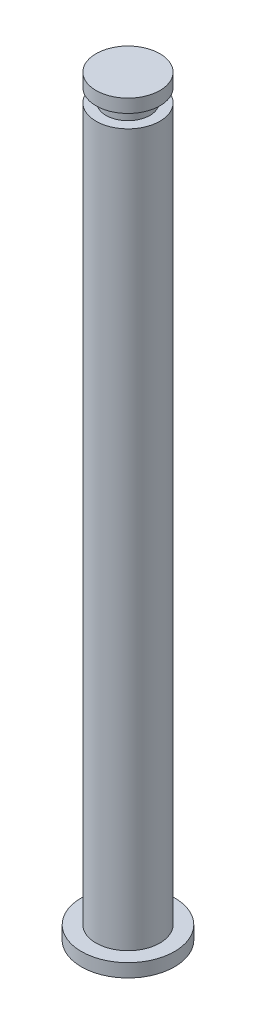
ISO-10303-21;
HEADER;
FILE_DESCRIPTION(('STEP AP214'),'2;1');
FILE_NAME('part.step','',(''),(''),'','','');
FILE_SCHEMA(('AUTOMOTIVE_DESIGN { 1 0 10303 214 1 1 1 1 }'));
ENDSEC;
DATA;
#1=APPLICATION_CONTEXT('core data for automotive mechanical design processes');
#2=APPLICATION_PROTOCOL_DEFINITION('international standard','automotive_design',2000,#1);
#3=PRODUCT_CONTEXT('',#1,'mechanical');
#4=PRODUCT('Part','Part','',(#3));
#5=PRODUCT_RELATED_PRODUCT_CATEGORY('part','',(#4));
#6=PRODUCT_DEFINITION_FORMATION('','',#4);
#7=PRODUCT_DEFINITION_CONTEXT('part definition',#1,'design');
#8=PRODUCT_DEFINITION('design','',#6,#7);
#9=PRODUCT_DEFINITION_SHAPE('','',#8);
#10=(LENGTH_UNIT() NAMED_UNIT(*) SI_UNIT(.MILLI.,.METRE.));
#11=(NAMED_UNIT(*) PLANE_ANGLE_UNIT() SI_UNIT($,.RADIAN.));
#12=(NAMED_UNIT(*) SI_UNIT($,.STERADIAN.) SOLID_ANGLE_UNIT());
#13=UNCERTAINTY_MEASURE_WITH_UNIT(LENGTH_MEASURE(1.E-05),#10,'distance_accuracy_value','');
#14=(GEOMETRIC_REPRESENTATION_CONTEXT(3) GLOBAL_UNCERTAINTY_ASSIGNED_CONTEXT((#13)) GLOBAL_UNIT_ASSIGNED_CONTEXT((#10,
#11,#12)) REPRESENTATION_CONTEXT('',''));
#15=CARTESIAN_POINT('',(0.,0.,0.));
#16=DIRECTION('',(0.,0.,1.));
#17=DIRECTION('',(1.,0.,0.));
#18=AXIS2_PLACEMENT_3D('',#15,#16,#17);
#19=CARTESIAN_POINT('',(0.,56.5,0.));
#20=DIRECTION('',(0.,-1.,0.));
#21=DIRECTION('',(0.,0.,-1.));
#22=AXIS2_PLACEMENT_3D('',#19,#20,#21);
#23=CYLINDRICAL_SURFACE('',#22,2.4);
#24=CARTESIAN_POINT('',(0.,1.,0.));
#25=DIRECTION('',(0.,1.,0.));
#26=DIRECTION('',(0.,0.,1.));
#27=AXIS2_PLACEMENT_3D('',#24,#25,#26);
#28=CIRCLE('',#27,2.4);
#29=CARTESIAN_POINT('',(0.,1.,2.4));
#30=VERTEX_POINT('',#29);
#31=EDGE_CURVE('E50',#30,#30,#28,.T.);
#32=ORIENTED_EDGE('',*,*,#31,.T.);
#33=EDGE_LOOP('',(#32));
#34=FACE_BOUND('',#33,.T.);
#35=CARTESIAN_POINT('',(0.,54.5,0.));
#36=DIRECTION('',(0.,1.,0.));
#37=DIRECTION('',(0.,0.,1.));
#38=AXIS2_PLACEMENT_3D('',#35,#36,#37);
#39=CIRCLE('',#38,2.4);
#40=CARTESIAN_POINT('',(0.,54.5,2.4));
#41=VERTEX_POINT('',#40);
#42=EDGE_CURVE('E57',#41,#41,#39,.T.);
#43=ORIENTED_EDGE('',*,*,#42,.F.);
#44=EDGE_LOOP('',(#43));
#45=FACE_BOUND('',#44,.T.);
#46=ADVANCED_FACE('F39',(#34,#45),#23,.T.);
#47=CARTESIAN_POINT('',(0.,1.,0.));
#48=DIRECTION('',(0.,1.,0.));
#49=DIRECTION('',(0.,0.,1.));
#50=AXIS2_PLACEMENT_3D('',#47,#48,#49);
#51=PLANE('',#50);
#52=CARTESIAN_POINT('',(0.,1.,0.));
#53=DIRECTION('',(0.,1.,0.));
#54=DIRECTION('',(0.,0.,1.));
#55=AXIS2_PLACEMENT_3D('',#52,#53,#54);
#56=CIRCLE('',#55,3.5);
#57=CARTESIAN_POINT('',(0.,1.,3.5));
#58=VERTEX_POINT('',#57);
#59=EDGE_CURVE('E10',#58,#58,#56,.T.);
#60=ORIENTED_EDGE('',*,*,#59,.T.);
#61=EDGE_LOOP('',(#60));
#62=FACE_BOUND('',#61,.T.);
#63=ORIENTED_EDGE('',*,*,#31,.F.);
#64=EDGE_LOOP('',(#63));
#65=FACE_BOUND('',#64,.T.);
#66=ADVANCED_FACE('F81',(#62,#65),#51,.T.);
#67=CARTESIAN_POINT('',(0.,0.,0.));
#68=DIRECTION('',(0.,1.,0.));
#69=DIRECTION('',(0.,0.,1.));
#70=AXIS2_PLACEMENT_3D('',#67,#68,#69);
#71=PLANE('',#70);
#72=CARTESIAN_POINT('',(0.,0.,0.));
#73=DIRECTION('',(0.,1.,0.));
#74=DIRECTION('',(0.,0.,1.));
#75=AXIS2_PLACEMENT_3D('',#72,#73,#74);
#76=CIRCLE('',#75,3.5);
#77=CARTESIAN_POINT('',(0.,0.,3.5));
#78=VERTEX_POINT('',#77);
#79=EDGE_CURVE('E43',#78,#78,#76,.T.);
#80=ORIENTED_EDGE('',*,*,#79,.F.);
#81=EDGE_LOOP('',(#80));
#82=FACE_BOUND('',#81,.T.);
#83=ADVANCED_FACE('F89',(#82),#71,.F.);
#84=CARTESIAN_POINT('',(0.,1.,0.));
#85=DIRECTION('',(0.,-1.,0.));
#86=DIRECTION('',(0.,0.,-1.));
#87=AXIS2_PLACEMENT_3D('',#84,#85,#86);
#88=CYLINDRICAL_SURFACE('',#87,3.5);
#89=ORIENTED_EDGE('',*,*,#59,.F.);
#90=EDGE_LOOP('',(#89));
#91=FACE_BOUND('',#90,.T.);
#92=ORIENTED_EDGE('',*,*,#79,.T.);
#93=EDGE_LOOP('',(#92));
#94=FACE_BOUND('',#93,.T.);
#95=ADVANCED_FACE('F41',(#91,#94),#88,.T.);
#96=CARTESIAN_POINT('',(0.,54.5,0.));
#97=DIRECTION('',(0.,1.,0.));
#98=DIRECTION('',(0.,0.,1.));
#99=AXIS2_PLACEMENT_3D('',#96,#97,#98);
#100=PLANE('',#99);
#101=CARTESIAN_POINT('',(0.,54.5,0.));
#102=DIRECTION('',(0.,1.,0.));
#103=DIRECTION('',(0.,0.,1.));
#104=AXIS2_PLACEMENT_3D('',#101,#102,#103);
#105=CIRCLE('',#104,1.65);
#106=CARTESIAN_POINT('',(0.,54.5,1.65));
#107=VERTEX_POINT('',#106);
#108=EDGE_CURVE('E61',#107,#107,#105,.T.);
#109=ORIENTED_EDGE('',*,*,#108,.F.);
#110=EDGE_LOOP('',(#109));
#111=FACE_BOUND('',#110,.T.);
#112=ORIENTED_EDGE('',*,*,#42,.T.);
#113=EDGE_LOOP('',(#112));
#114=FACE_BOUND('',#113,.T.);
#115=ADVANCED_FACE('F73',(#111,#114),#100,.T.);
#116=CARTESIAN_POINT('',(0.,55.5,0.));
#117=DIRECTION('',(0.,1.,0.));
#118=DIRECTION('',(0.,0.,1.));
#119=AXIS2_PLACEMENT_3D('',#116,#117,#118);
#120=PLANE('',#119);
#121=CARTESIAN_POINT('',(0.,55.5,0.));
#122=DIRECTION('',(0.,1.,0.));
#123=DIRECTION('',(0.,0.,1.));
#124=AXIS2_PLACEMENT_3D('',#121,#122,#123);
#125=CIRCLE('',#124,1.65);
#126=CARTESIAN_POINT('',(0.,55.5,1.65));
#127=VERTEX_POINT('',#126);
#128=EDGE_CURVE('E64',#127,#127,#125,.T.);
#129=ORIENTED_EDGE('',*,*,#128,.T.);
#130=EDGE_LOOP('',(#129));
#131=FACE_BOUND('',#130,.T.);
#132=CARTESIAN_POINT('',(0.,55.5,0.));
#133=DIRECTION('',(0.,1.,0.));
#134=DIRECTION('',(0.,0.,1.));
#135=AXIS2_PLACEMENT_3D('',#132,#133,#134);
#136=CIRCLE('',#135,2.4);
#137=CARTESIAN_POINT('',(0.,55.5,2.4));
#138=VERTEX_POINT('',#137);
#139=EDGE_CURVE('E58',#138,#138,#136,.T.);
#140=ORIENTED_EDGE('',*,*,#139,.F.);
#141=EDGE_LOOP('',(#140));
#142=FACE_BOUND('',#141,.T.);
#143=ADVANCED_FACE('F76',(#131,#142),#120,.F.);
#144=CARTESIAN_POINT('',(0.,54.5,0.));
#145=DIRECTION('',(0.,1.,0.));
#146=DIRECTION('',(0.,0.,1.));
#147=AXIS2_PLACEMENT_3D('',#144,#145,#146);
#148=CYLINDRICAL_SURFACE('',#147,1.65);
#149=ORIENTED_EDGE('',*,*,#108,.T.);
#150=EDGE_LOOP('',(#149));
#151=FACE_BOUND('',#150,.T.);
#152=ORIENTED_EDGE('',*,*,#128,.F.);
#153=EDGE_LOOP('',(#152));
#154=FACE_BOUND('',#153,.T.);
#155=ADVANCED_FACE('F70',(#151,#154),#148,.T.);
#156=CARTESIAN_POINT('',(0.,56.5,0.));
#157=DIRECTION('',(0.,1.,0.));
#158=DIRECTION('',(0.,0.,1.));
#159=AXIS2_PLACEMENT_3D('',#156,#157,#158);
#160=PLANE('',#159);
#161=CARTESIAN_POINT('',(0.,56.5,0.));
#162=DIRECTION('',(0.,1.,0.));
#163=DIRECTION('',(0.,0.,1.));
#164=AXIS2_PLACEMENT_3D('',#161,#162,#163);
#165=CIRCLE('',#164,2.4);
#166=CARTESIAN_POINT('',(0.,56.5,2.4));
#167=VERTEX_POINT('',#166);
#168=EDGE_CURVE('E54',#167,#167,#165,.T.);
#169=ORIENTED_EDGE('',*,*,#168,.T.);
#170=EDGE_LOOP('',(#169));
#171=FACE_BOUND('',#170,.T.);
#172=ADVANCED_FACE('F93',(#171),#160,.T.);
#173=ORIENTED_EDGE('',*,*,#139,.T.);
#174=EDGE_LOOP('',(#173));
#175=FACE_BOUND('',#174,.T.);
#176=ORIENTED_EDGE('',*,*,#168,.F.);
#177=EDGE_LOOP('',(#176));
#178=FACE_BOUND('',#177,.T.);
#179=ADVANCED_FACE('F84',(#175,#178),#23,.T.);
#180=CLOSED_SHELL('',(#46,#66,#83,#95,#115,#143,#155,#172,#179));
#181=MANIFOLD_SOLID_BREP('B2',#180);
#182=ADVANCED_BREP_SHAPE_REPRESENTATION('',(#18,#181),#14);
#183=SHAPE_DEFINITION_REPRESENTATION(#9,#182);
ENDSEC;
END-ISO-10303-21;
